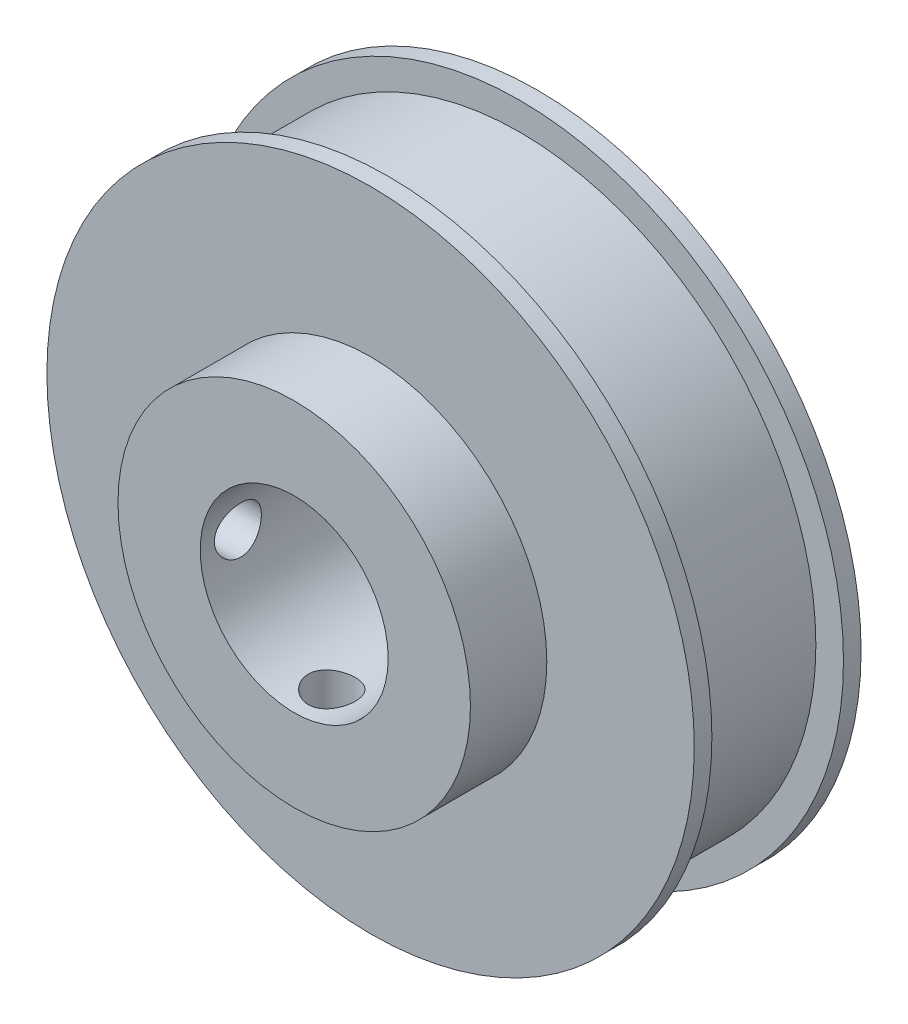
ISO-10303-21;
HEADER;
FILE_DESCRIPTION(('STEP AP214'),'2;1');
FILE_NAME('part.step','',(''),(''),'','','');
FILE_SCHEMA(('AUTOMOTIVE_DESIGN { 1 0 10303 214 1 1 1 1 }'));
ENDSEC;
DATA;
#1=APPLICATION_CONTEXT('core data for automotive mechanical design processes');
#2=APPLICATION_PROTOCOL_DEFINITION('international standard','automotive_design',2000,#1);
#3=PRODUCT_CONTEXT('',#1,'mechanical');
#4=PRODUCT('Part','Part','',(#3));
#5=PRODUCT_RELATED_PRODUCT_CATEGORY('part','',(#4));
#6=PRODUCT_DEFINITION_FORMATION('','',#4);
#7=PRODUCT_DEFINITION_CONTEXT('part definition',#1,'design');
#8=PRODUCT_DEFINITION('design','',#6,#7);
#9=PRODUCT_DEFINITION_SHAPE('','',#8);
#10=(LENGTH_UNIT() NAMED_UNIT(*) SI_UNIT(.MILLI.,.METRE.));
#11=(NAMED_UNIT(*) PLANE_ANGLE_UNIT() SI_UNIT($,.RADIAN.));
#12=(NAMED_UNIT(*) SI_UNIT($,.STERADIAN.) SOLID_ANGLE_UNIT());
#13=UNCERTAINTY_MEASURE_WITH_UNIT(LENGTH_MEASURE(1.E-05),#10,'distance_accuracy_value','');
#14=(GEOMETRIC_REPRESENTATION_CONTEXT(3) GLOBAL_UNCERTAINTY_ASSIGNED_CONTEXT((#13)) GLOBAL_UNIT_ASSIGNED_CONTEXT((#10,
#11,#12)) REPRESENTATION_CONTEXT('',''));
#15=CARTESIAN_POINT('',(0.,0.,0.));
#16=DIRECTION('',(0.,0.,1.));
#17=DIRECTION('',(1.,0.,0.));
#18=AXIS2_PLACEMENT_3D('',#15,#16,#17);
#19=CARTESIAN_POINT('',(0.,0.,14.2));
#20=DIRECTION('',(0.,0.,1.));
#21=DIRECTION('',(1.,0.,0.));
#22=AXIS2_PLACEMENT_3D('',#19,#20,#21);
#23=PLANE('',#22);
#24=CARTESIAN_POINT('',(0.,0.,14.2));
#25=DIRECTION('',(0.,0.,1.));
#26=DIRECTION('',(1.,0.,0.));
#27=AXIS2_PLACEMENT_3D('',#24,#25,#26);
#28=CIRCLE('',#27,27.55);
#29=CARTESIAN_POINT('',(27.55,0.,14.2));
#30=VERTEX_POINT('',#29);
#31=EDGE_CURVE('E144',#30,#30,#28,.T.);
#32=ORIENTED_EDGE('',*,*,#31,.T.);
#33=EDGE_LOOP('',(#32));
#34=FACE_BOUND('',#33,.T.);
#35=CARTESIAN_POINT('',(0.,0.,14.2));
#36=DIRECTION('',(0.,0.,1.));
#37=DIRECTION('',(1.,0.,0.));
#38=AXIS2_PLACEMENT_3D('',#35,#36,#37);
#39=CIRCLE('',#38,15.);
#40=CARTESIAN_POINT('',(15.,0.,14.2));
#41=VERTEX_POINT('',#40);
#42=EDGE_CURVE('E59',#41,#41,#39,.T.);
#43=ORIENTED_EDGE('',*,*,#42,.F.);
#44=EDGE_LOOP('',(#43));
#45=FACE_BOUND('',#44,.T.);
#46=ADVANCED_FACE('F31',(#34,#45),#23,.T.);
#47=CARTESIAN_POINT('',(0.,0.,1.5));
#48=DIRECTION('',(0.,0.,1.));
#49=DIRECTION('',(1.,0.,0.));
#50=AXIS2_PLACEMENT_3D('',#47,#48,#49);
#51=PLANE('',#50);
#52=CARTESIAN_POINT('',(0.,0.,1.5));
#53=DIRECTION('',(0.,0.,1.));
#54=DIRECTION('',(1.,0.,0.));
#55=AXIS2_PLACEMENT_3D('',#52,#53,#54);
#56=CIRCLE('',#55,27.55);
#57=CARTESIAN_POINT('',(27.55,0.,1.5));
#58=VERTEX_POINT('',#57);
#59=EDGE_CURVE('E10',#58,#58,#56,.T.);
#60=ORIENTED_EDGE('',*,*,#59,.T.);
#61=EDGE_LOOP('',(#60));
#62=FACE_BOUND('',#61,.T.);
#63=CARTESIAN_POINT('',(0.,0.,1.5));
#64=DIRECTION('',(0.,0.,1.));
#65=DIRECTION('',(1.,0.,0.));
#66=AXIS2_PLACEMENT_3D('',#63,#64,#65);
#67=CIRCLE('',#66,25.2);
#68=CARTESIAN_POINT('',(25.2,0.,1.5));
#69=VERTEX_POINT('',#68);
#70=EDGE_CURVE('E51',#69,#69,#67,.T.);
#71=ORIENTED_EDGE('',*,*,#70,.F.);
#72=EDGE_LOOP('',(#71));
#73=FACE_BOUND('',#72,.T.);
#74=ADVANCED_FACE('F97',(#62,#73),#51,.T.);
#75=CARTESIAN_POINT('',(0.,0.,1.5));
#76=DIRECTION('',(0.,0.,-1.));
#77=DIRECTION('',(-1.,0.,0.));
#78=AXIS2_PLACEMENT_3D('',#75,#76,#77);
#79=CYLINDRICAL_SURFACE('',#78,27.55);
#80=ORIENTED_EDGE('',*,*,#59,.F.);
#81=EDGE_LOOP('',(#80));
#82=FACE_BOUND('',#81,.T.);
#83=CARTESIAN_POINT('',(0.,0.,0.));
#84=DIRECTION('',(0.,0.,1.));
#85=DIRECTION('',(1.,0.,0.));
#86=AXIS2_PLACEMENT_3D('',#83,#84,#85);
#87=CIRCLE('',#86,27.55);
#88=CARTESIAN_POINT('',(27.55,0.,0.));
#89=VERTEX_POINT('',#88);
#90=EDGE_CURVE('E43',#89,#89,#87,.T.);
#91=ORIENTED_EDGE('',*,*,#90,.T.);
#92=EDGE_LOOP('',(#91));
#93=FACE_BOUND('',#92,.T.);
#94=ADVANCED_FACE('F33',(#82,#93),#79,.T.);
#95=CARTESIAN_POINT('',(0.,0.,0.));
#96=DIRECTION('',(0.,0.,1.));
#97=DIRECTION('',(1.,0.,0.));
#98=AXIS2_PLACEMENT_3D('',#95,#96,#97);
#99=PLANE('',#98);
#100=CARTESIAN_POINT('',(0.,0.,0.));
#101=DIRECTION('',(0.,0.,1.));
#102=DIRECTION('',(1.,0.,0.));
#103=AXIS2_PLACEMENT_3D('',#100,#101,#102);
#104=CIRCLE('',#103,8.);
#105=CARTESIAN_POINT('',(8.,0.,0.));
#106=VERTEX_POINT('',#105);
#107=EDGE_CURVE('E127',#106,#106,#104,.T.);
#108=ORIENTED_EDGE('',*,*,#107,.T.);
#109=EDGE_LOOP('',(#108));
#110=FACE_BOUND('',#109,.T.);
#111=ORIENTED_EDGE('',*,*,#90,.F.);
#112=EDGE_LOOP('',(#111));
#113=FACE_BOUND('',#112,.T.);
#114=ADVANCED_FACE('F116',(#110,#113),#99,.F.);
#115=CARTESIAN_POINT('',(0.,0.,12.7));
#116=DIRECTION('',(0.,0.,-1.));
#117=DIRECTION('',(-1.,0.,0.));
#118=AXIS2_PLACEMENT_3D('',#115,#116,#117);
#119=CYLINDRICAL_SURFACE('',#118,25.2);
#120=CARTESIAN_POINT('',(0.,0.,12.7));
#121=DIRECTION('',(0.,0.,1.));
#122=DIRECTION('',(1.,0.,0.));
#123=AXIS2_PLACEMENT_3D('',#120,#121,#122);
#124=CIRCLE('',#123,25.2);
#125=CARTESIAN_POINT('',(25.2,0.,12.7));
#126=VERTEX_POINT('',#125);
#127=EDGE_CURVE('E48',#126,#126,#124,.T.);
#128=ORIENTED_EDGE('',*,*,#127,.F.);
#129=EDGE_LOOP('',(#128));
#130=FACE_BOUND('',#129,.T.);
#131=ORIENTED_EDGE('',*,*,#70,.T.);
#132=EDGE_LOOP('',(#131));
#133=FACE_BOUND('',#132,.T.);
#134=ADVANCED_FACE('F110',(#130,#133),#119,.T.);
#135=CARTESIAN_POINT('',(0.,0.,12.7));
#136=DIRECTION('',(0.,0.,1.));
#137=DIRECTION('',(1.,0.,0.));
#138=AXIS2_PLACEMENT_3D('',#135,#136,#137);
#139=PLANE('',#138);
#140=CARTESIAN_POINT('',(0.,0.,12.7));
#141=DIRECTION('',(0.,0.,1.));
#142=DIRECTION('',(1.,0.,0.));
#143=AXIS2_PLACEMENT_3D('',#140,#141,#142);
#144=CIRCLE('',#143,27.55);
#145=CARTESIAN_POINT('',(27.55,0.,12.7));
#146=VERTEX_POINT('',#145);
#147=EDGE_CURVE('E142',#146,#146,#144,.T.);
#148=ORIENTED_EDGE('',*,*,#147,.F.);
#149=EDGE_LOOP('',(#148));
#150=FACE_BOUND('',#149,.T.);
#151=ORIENTED_EDGE('',*,*,#127,.T.);
#152=EDGE_LOOP('',(#151));
#153=FACE_BOUND('',#152,.T.);
#154=ADVANCED_FACE('F106',(#150,#153),#139,.F.);
#155=CARTESIAN_POINT('',(0.,0.,14.2));
#156=DIRECTION('',(0.,0.,-1.));
#157=DIRECTION('',(-1.,0.,0.));
#158=AXIS2_PLACEMENT_3D('',#155,#156,#157);
#159=CYLINDRICAL_SURFACE('',#158,27.55);
#160=ORIENTED_EDGE('',*,*,#31,.F.);
#161=EDGE_LOOP('',(#160));
#162=FACE_BOUND('',#161,.T.);
#163=ORIENTED_EDGE('',*,*,#147,.T.);
#164=EDGE_LOOP('',(#163));
#165=FACE_BOUND('',#164,.T.);
#166=ADVANCED_FACE('F109',(#162,#165),#159,.T.);
#167=CARTESIAN_POINT('',(0.,0.,20.7));
#168=DIRECTION('',(0.,0.,-1.));
#169=DIRECTION('',(-1.,0.,0.));
#170=AXIS2_PLACEMENT_3D('',#167,#168,#169);
#171=CYLINDRICAL_SURFACE('',#170,15.);
#172=CARTESIAN_POINT('',(-15.,0.,19.5));
#173=CARTESIAN_POINT('',(-14.9999983574254,-0.111808835669284,19.4999952902931));
#174=CARTESIAN_POINT('',(-14.9987367072719,-0.22368597927628,19.4905924620375));
#175=CARTESIAN_POINT('',(-14.993825111269,-0.444322725138079,19.4532336509504));
#176=CARTESIAN_POINT('',(-14.9901727244172,-0.553079022333037,19.4252587051029));
#177=CARTESIAN_POINT('',(-14.9808907984907,-0.764248312626984,19.3515982824586));
#178=CARTESIAN_POINT('',(-14.9752626421097,-0.866665683058493,19.3059251889616));
#179=CARTESIAN_POINT('',(-14.9626538666039,-1.0623638950303,19.1981930861937));
#180=CARTESIAN_POINT('',(-14.9556734655857,-1.15564620633703,19.1361367188335));
#181=CARTESIAN_POINT('',(-14.9410899478996,-1.33102582250468,18.9969867383958));
#182=CARTESIAN_POINT('',(-14.9334835816211,-1.41305798549586,18.9198113549915));
#183=CARTESIAN_POINT('',(-14.9185313755795,-1.56304735673102,18.7527898109233));
#184=CARTESIAN_POINT('',(-14.9111855496234,-1.63100381997221,18.6629429800042));
#185=CARTESIAN_POINT('',(-14.8975543544019,-1.75115902268907,18.472700877055));
#186=CARTESIAN_POINT('',(-14.8912731776576,-1.80329607482578,18.3722663175214));
#187=CARTESIAN_POINT('',(-14.8805258737923,-1.8899384500729,18.1639689327632));
#188=CARTESIAN_POINT('',(-14.8760596685121,-1.92444453245278,18.0561064276467));
#189=CARTESIAN_POINT('',(-14.8694793656867,-1.97464606772174,17.8366941894984));
#190=CARTESIAN_POINT('',(-14.8673514537014,-1.99045204228507,17.7251701654671));
#191=CARTESIAN_POINT('',(-14.8656465160931,-2.00314680548117,17.501033820394));
#192=CARTESIAN_POINT('',(-14.866069374204,-2.00003645633601,17.3884215491891));
#193=CARTESIAN_POINT('',(-14.8694055577299,-1.97507745939235,17.1660788699721));
#194=CARTESIAN_POINT('',(-14.8723026462234,-1.95335097531762,17.0563344701143));
#195=CARTESIAN_POINT('',(-14.8802355277475,-1.89196724634372,16.8420631632399));
#196=CARTESIAN_POINT('',(-14.8852713695413,-1.85230959261458,16.737536375245));
#197=CARTESIAN_POINT('',(-14.8969326111103,-1.75605929143191,16.5362903652928));
#198=CARTESIAN_POINT('',(-14.903562941239,-1.69941397913749,16.4395966288057));
#199=CARTESIAN_POINT('',(-14.9176623621993,-1.57083393344289,16.2570409180823));
#200=CARTESIAN_POINT('',(-14.9251314966353,-1.49889840502385,16.1711795074458));
#201=CARTESIAN_POINT('',(-14.9401389923359,-1.34110490026363,16.0120169874181));
#202=CARTESIAN_POINT('',(-14.947677435412,-1.25514170702645,15.9388201572977));
#203=CARTESIAN_POINT('',(-14.9619192381826,-1.07209417013341,15.8078779550716));
#204=CARTESIAN_POINT('',(-14.9686225954715,-0.975009794442371,15.7501326274765));
#205=CARTESIAN_POINT('',(-14.9804439374358,-0.772392219730472,15.6517308823053));
#206=CARTESIAN_POINT('',(-14.9855612720896,-0.666855578841232,15.6110814689537));
#207=CARTESIAN_POINT('',(-14.9936282590407,-0.450370924336252,15.5481106810277));
#208=CARTESIAN_POINT('',(-14.9965780268993,-0.33942319954226,15.5257883293606));
#209=CARTESIAN_POINT('',(-14.9999624137686,-0.116166903325648,15.5002415672289));
#210=CARTESIAN_POINT('',(-15.0004159384905,-0.00387503454704613,15.4968735982165));
#211=CARTESIAN_POINT('',(-14.9988079153852,0.219671617218714,15.5089516641272));
#212=CARTESIAN_POINT('',(-14.996746428686,0.330926425345661,15.5243972417824));
#213=CARTESIAN_POINT('',(-14.990351753581,0.548813715572934,15.573544653384));
#214=CARTESIAN_POINT('',(-14.9860271430292,0.655462016512041,15.6071775683222));
#215=CARTESIAN_POINT('',(-14.9755900925429,0.861605098793556,15.6916729659371));
#216=CARTESIAN_POINT('',(-14.9694775843944,0.961099607015634,15.7425361060133));
#217=CARTESIAN_POINT('',(-14.9560983737007,1.15074887861607,15.8603921555833));
#218=CARTESIAN_POINT('',(-14.9488251504572,1.2408458143966,15.9274773657133));
#219=CARTESIAN_POINT('',(-14.9339572870998,1.40855294699189,16.0757433292243));
#220=CARTESIAN_POINT('',(-14.9263626324062,1.48616257662378,16.1569247225164));
#221=CARTESIAN_POINT('',(-14.9116490247351,1.62720549423098,16.3317131426396));
#222=CARTESIAN_POINT('',(-14.904533487753,1.69054327608938,16.4253975667382));
#223=CARTESIAN_POINT('',(-14.8916413300182,1.80058351078813,16.6221594102809));
#224=CARTESIAN_POINT('',(-14.8858646793678,1.84728633510346,16.7252366199104));
#225=CARTESIAN_POINT('',(-14.8763281178008,1.92257836500746,16.9375572420277));
#226=CARTESIAN_POINT('',(-14.872562342326,1.95122028846795,17.0467816852108));
#227=CARTESIAN_POINT('',(-14.8674574869829,1.98974667143958,17.2685436321288));
#228=CARTESIAN_POINT('',(-14.8661182773134,1.99963213426781,17.3810809583244));
#229=CARTESIAN_POINT('',(-14.8660223129545,2.00034485806189,17.6053234908535));
#230=CARTESIAN_POINT('',(-14.8672452228252,1.99132219194492,17.7170282409642));
#231=CARTESIAN_POINT('',(-14.872091838742,1.95479376686689,17.9373178751039));
#232=CARTESIAN_POINT('',(-14.8757155438883,1.92728801483268,18.045902760302));
#233=CARTESIAN_POINT('',(-14.8849489027276,1.85462310332207,18.2568436832516));
#234=CARTESIAN_POINT('',(-14.890557626594,1.80947220819041,18.3592026111169));
#235=CARTESIAN_POINT('',(-14.9031304571282,1.70281342759737,18.5549158838261));
#236=CARTESIAN_POINT('',(-14.910094589966,1.64130522630428,18.648270054756));
#237=CARTESIAN_POINT('',(-14.9246596718306,1.50312448509508,18.8240896499284));
#238=CARTESIAN_POINT('',(-14.9322650575408,1.42634027226901,18.9064669477551));
#239=CARTESIAN_POINT('',(-14.9472171900166,1.26002169349824,19.0572232163615));
#240=CARTESIAN_POINT('',(-14.9545638756898,1.17048434072977,19.1255988987502));
#241=CARTESIAN_POINT('',(-14.9682063513753,0.980752987852819,19.2466671384665));
#242=CARTESIAN_POINT('',(-14.9744974642689,0.880514620743964,19.2992906665552));
#243=CARTESIAN_POINT('',(-14.9852732065897,0.672592409587328,19.3868805985451));
#244=CARTESIAN_POINT('',(-14.9897597692431,0.564916678969889,19.4218659086249));
#245=CARTESIAN_POINT('',(-14.9953572174327,0.380588408098419,19.4649480063852));
#246=CARTESIAN_POINT('',(-14.9970896363507,0.305091081955779,19.4780732435236));
#247=CARTESIAN_POINT('',(-14.9994115849077,0.153073171616112,19.4956008141655));
#248=CARTESIAN_POINT('',(-15.000001124628,0.0765525964512405,19.5000032246136));
#249=CARTESIAN_POINT('',(-15.,0.,19.5));
#250=B_SPLINE_CURVE_WITH_KNOTS('',3,(#172,#173,#174,#175,#176,#177,#178,#179,#180,#181,#182,
#183,#184,#185,#186,#187,#188,#189,#190,#191,#192,#193,#194,#195,#196,#197,#198,#199,#200,#201,
#202,#203,#204,#205,#206,#207,#208,#209,#210,#211,#212,#213,#214,#215,#216,#217,#218,#219,#220,
#221,#222,#223,#224,#225,#226,#227,#228,#229,#230,#231,#232,#233,#234,#235,#236,#237,#238,#239,
#240,#241,#242,#243,#244,#245,#246,#247,#248,#249),.UNSPECIFIED.,.T.,.F.,(4,2,2,2,2,2,2,2,2,2,2,
2,2,2,2,2,2,2,2,2,2,2,2,2,2,2,2,2,2,2,2,2,2,2,2,2,2,2,4),(0.,0.335146851305743,
0.670636430885044,1.0058916928274,1.34109292564034,1.67815978443559,2.01524447904836,
2.35362721511647,2.69199537766204,3.02835355914359,3.3646964092492,3.69884885098043,
4.0330089117585,4.36821583137897,4.70344018443797,5.0413054448485,5.37917167852296,
5.71717620202539,6.05516270391743,6.39058584992061,6.72600084354478,7.06015363396463,
7.39431917503546,7.73043274769884,8.06656158258761,8.4048770453545,8.74318495273048,
9.08050074735454,9.41779849783634,9.75242927496624,10.0870599266875,10.4215340370262,
10.756014605959,11.0930366783511,11.4301378125116,11.7686952667451,12.1068890499242,
12.3363573904731,12.5658237068544),.UNSPECIFIED.);
#251=CARTESIAN_POINT('',(-15.,0.,19.5));
#252=VERTEX_POINT('',#251);
#253=EDGE_CURVE('E60',#252,#252,#250,.T.);
#254=ORIENTED_EDGE('',*,*,#253,.T.);
#255=EDGE_LOOP('',(#254));
#256=FACE_BOUND('',#255,.T.);
#257=CARTESIAN_POINT('',(0.,-15.,19.5));
#258=CARTESIAN_POINT('',(0.111808835669287,-14.9999983574254,19.4999952902931));
#259=CARTESIAN_POINT('',(0.223685979276282,-14.9987367072719,19.4905924620375));
#260=CARTESIAN_POINT('',(0.444322725138081,-14.993825111269,19.4532336509504));
#261=CARTESIAN_POINT('',(0.553079022333039,-14.9901727244172,19.4252587051029));
#262=CARTESIAN_POINT('',(0.764248312626988,-14.9808907984907,19.3515982824585));
#263=CARTESIAN_POINT('',(0.866665683058498,-14.9752626421097,19.3059251889616));
#264=CARTESIAN_POINT('',(1.0623638950303,-14.9626538666039,19.1981930861937));
#265=CARTESIAN_POINT('',(1.15564620633703,-14.9556734655857,19.1361367188335));
#266=CARTESIAN_POINT('',(1.33102582250468,-14.9410899478996,18.9969867383958));
#267=CARTESIAN_POINT('',(1.41305798549587,-14.9334835816211,18.9198113549915));
#268=CARTESIAN_POINT('',(1.56304735673102,-14.9185313755795,18.7527898109233));
#269=CARTESIAN_POINT('',(1.63100381997222,-14.9111855496234,18.6629429800042));
#270=CARTESIAN_POINT('',(1.75115902268908,-14.8975543544019,18.472700877055));
#271=CARTESIAN_POINT('',(1.80329607482578,-14.8912731776576,18.3722663175214));
#272=CARTESIAN_POINT('',(1.88993845007291,-14.8805258737923,18.1639689327632));
#273=CARTESIAN_POINT('',(1.92444453245278,-14.8760596685121,18.0561064276467));
#274=CARTESIAN_POINT('',(1.97464606772174,-14.8694793656867,17.8366941894983));
#275=CARTESIAN_POINT('',(1.99045204228507,-14.8673514537014,17.7251701654671));
#276=CARTESIAN_POINT('',(2.00314680548118,-14.8656465160931,17.501033820394));
#277=CARTESIAN_POINT('',(2.00003645633601,-14.866069374204,17.3884215491891));
#278=CARTESIAN_POINT('',(1.97507745939235,-14.8694055577299,17.1660788699721));
#279=CARTESIAN_POINT('',(1.95335097531762,-14.8723026462234,17.0563344701143));
#280=CARTESIAN_POINT('',(1.89196724634372,-14.8802355277475,16.8420631632399));
#281=CARTESIAN_POINT('',(1.85230959261458,-14.8852713695413,16.737536375245));
#282=CARTESIAN_POINT('',(1.75605929143191,-14.8969326111103,16.5362903652928));
#283=CARTESIAN_POINT('',(1.69941397913749,-14.903562941239,16.4395966288057));
#284=CARTESIAN_POINT('',(1.57083393344289,-14.9176623621993,16.2570409180823));
#285=CARTESIAN_POINT('',(1.49889840502385,-14.9251314966353,16.1711795074458));
#286=CARTESIAN_POINT('',(1.34110490026363,-14.9401389923359,16.0120169874181));
#287=CARTESIAN_POINT('',(1.25514170702645,-14.947677435412,15.9388201572977));
#288=CARTESIAN_POINT('',(1.07209417013341,-14.9619192381826,15.8078779550716));
#289=CARTESIAN_POINT('',(0.97500979444237,-14.9686225954715,15.7501326274765));
#290=CARTESIAN_POINT('',(0.772392219730471,-14.9804439374358,15.6517308823053));
#291=CARTESIAN_POINT('',(0.666855578841231,-14.9855612720896,15.6110814689537));
#292=CARTESIAN_POINT('',(0.45037092433625,-14.9936282590407,15.5481106810277));
#293=CARTESIAN_POINT('',(0.339423199542258,-14.9965780268993,15.5257883293606));
#294=CARTESIAN_POINT('',(0.116166903325644,-14.9999624137686,15.5002415672289));
#295=CARTESIAN_POINT('',(0.00387503454704304,-15.0004159384905,15.4968735982165));
#296=CARTESIAN_POINT('',(-0.219671617218717,-14.9988079153852,15.5089516641272));
#297=CARTESIAN_POINT('',(-0.330926425345664,-14.996746428686,15.5243972417824));
#298=CARTESIAN_POINT('',(-0.548813715572937,-14.990351753581,15.573544653384));
#299=CARTESIAN_POINT('',(-0.655462016512044,-14.9860271430292,15.6071775683222));
#300=CARTESIAN_POINT('',(-0.861605098793559,-14.9755900925429,15.6916729659371));
#301=CARTESIAN_POINT('',(-0.961099607015637,-14.9694775843944,15.7425361060133));
#302=CARTESIAN_POINT('',(-1.15074887861608,-14.9560983737007,15.8603921555833));
#303=CARTESIAN_POINT('',(-1.2408458143966,-14.9488251504572,15.9274773657133));
#304=CARTESIAN_POINT('',(-1.40855294699189,-14.9339572870998,16.0757433292243));
#305=CARTESIAN_POINT('',(-1.48616257662378,-14.9263626324062,16.1569247225164));
#306=CARTESIAN_POINT('',(-1.62720549423098,-14.9116490247351,16.3317131426396));
#307=CARTESIAN_POINT('',(-1.69054327608938,-14.904533487753,16.4253975667382));
#308=CARTESIAN_POINT('',(-1.80058351078814,-14.8916413300182,16.6221594102809));
#309=CARTESIAN_POINT('',(-1.84728633510346,-14.8858646793678,16.7252366199104));
#310=CARTESIAN_POINT('',(-1.92257836500746,-14.8763281178008,16.9375572420277));
#311=CARTESIAN_POINT('',(-1.95122028846795,-14.872562342326,17.0467816852108));
#312=CARTESIAN_POINT('',(-1.98974667143959,-14.8674574869829,17.2685436321288));
#313=CARTESIAN_POINT('',(-1.99963213426782,-14.8661182773134,17.3810809583244));
#314=CARTESIAN_POINT('',(-2.00034485806189,-14.8660223129545,17.6053234908535));
#315=CARTESIAN_POINT('',(-1.99132219194492,-14.8672452228252,17.7170282409642));
#316=CARTESIAN_POINT('',(-1.95479376686689,-14.872091838742,17.9373178751039));
#317=CARTESIAN_POINT('',(-1.92728801483268,-14.8757155438883,18.045902760302));
#318=CARTESIAN_POINT('',(-1.85462310332207,-14.8849489027276,18.2568436832516));
#319=CARTESIAN_POINT('',(-1.80947220819041,-14.890557626594,18.3592026111169));
#320=CARTESIAN_POINT('',(-1.70281342759737,-14.9031304571282,18.5549158838261));
#321=CARTESIAN_POINT('',(-1.64130522630428,-14.910094589966,18.648270054756));
#322=CARTESIAN_POINT('',(-1.50312448509508,-14.9246596718306,18.8240896499284));
#323=CARTESIAN_POINT('',(-1.42634027226901,-14.9322650575408,18.9064669477551));
#324=CARTESIAN_POINT('',(-1.26002169349823,-14.9472171900166,19.0572232163615));
#325=CARTESIAN_POINT('',(-1.17048434072977,-14.9545638756898,19.1255988987503));
#326=CARTESIAN_POINT('',(-0.980752987852821,-14.9682063513753,19.2466671384665));
#327=CARTESIAN_POINT('',(-0.880514620743962,-14.9744974642689,19.2992906665552));
#328=CARTESIAN_POINT('',(-0.672592409587325,-14.9852732065897,19.3868805985451));
#329=CARTESIAN_POINT('',(-0.564916678969886,-14.9897597692431,19.4218659086249));
#330=CARTESIAN_POINT('',(-0.380588408098415,-14.9953572174327,19.4649480063852));
#331=CARTESIAN_POINT('',(-0.305091081955775,-14.9970896363507,19.4780732435236));
#332=CARTESIAN_POINT('',(-0.153073171616109,-14.9994115849077,19.4956008141655));
#333=CARTESIAN_POINT('',(-0.0765525964512377,-15.000001124628,19.5000032246136));
#334=CARTESIAN_POINT('',(0.,-15.,19.5));
#335=B_SPLINE_CURVE_WITH_KNOTS('',3,(#257,#258,#259,#260,#261,#262,#263,#264,#265,#266,#267,
#268,#269,#270,#271,#272,#273,#274,#275,#276,#277,#278,#279,#280,#281,#282,#283,#284,#285,#286,
#287,#288,#289,#290,#291,#292,#293,#294,#295,#296,#297,#298,#299,#300,#301,#302,#303,#304,#305,
#306,#307,#308,#309,#310,#311,#312,#313,#314,#315,#316,#317,#318,#319,#320,#321,#322,#323,#324,
#325,#326,#327,#328,#329,#330,#331,#332,#333,#334),.UNSPECIFIED.,.T.,.F.,(4,2,2,2,2,2,2,2,2,2,2,
2,2,2,2,2,2,2,2,2,2,2,2,2,2,2,2,2,2,2,2,2,2,2,2,2,2,2,4),(0.,0.335146851305743,
0.670636430885046,1.00589169282741,1.34109292564035,1.67815978443559,2.01524447904836,
2.35362721511648,2.69199537766205,3.02835355914359,3.3646964092492,3.69884885098043,
4.0330089117585,4.36821583137898,4.70344018443797,5.0413054448485,5.37917167852296,
5.71717620202539,6.05516270391743,6.39058584992061,6.72600084354479,7.06015363396464,
7.39431917503546,7.73043274769884,8.06656158258762,8.4048770453545,8.74318495273048,
9.08050074735455,9.41779849783635,9.75242927496625,10.0870599266875,10.4215340370262,
10.756014605959,11.0930366783511,11.4301378125116,11.7686952667452,12.1068890499242,
12.3363573904731,12.5658237068544),.UNSPECIFIED.);
#336=CARTESIAN_POINT('',(0.,-15.,19.5));
#337=VERTEX_POINT('',#336);
#338=EDGE_CURVE('E53',#337,#337,#335,.T.);
#339=ORIENTED_EDGE('',*,*,#338,.T.);
#340=EDGE_LOOP('',(#339));
#341=FACE_BOUND('',#340,.T.);
#342=CARTESIAN_POINT('',(0.,0.,20.7));
#343=DIRECTION('',(0.,0.,1.));
#344=DIRECTION('',(1.,0.,0.));
#345=AXIS2_PLACEMENT_3D('',#342,#343,#344);
#346=CIRCLE('',#345,15.);
#347=CARTESIAN_POINT('',(15.,0.,20.7));
#348=VERTEX_POINT('',#347);
#349=EDGE_CURVE('E140',#348,#348,#346,.T.);
#350=ORIENTED_EDGE('',*,*,#349,.F.);
#351=EDGE_LOOP('',(#350));
#352=FACE_BOUND('',#351,.T.);
#353=ORIENTED_EDGE('',*,*,#42,.T.);
#354=EDGE_LOOP('',(#353));
#355=FACE_BOUND('',#354,.T.);
#356=ADVANCED_FACE('F61',(#256,#341,#352,#355),#171,.T.);
#357=CARTESIAN_POINT('',(0.,0.,20.7));
#358=DIRECTION('',(0.,0.,1.));
#359=DIRECTION('',(1.,0.,0.));
#360=AXIS2_PLACEMENT_3D('',#357,#358,#359);
#361=PLANE('',#360);
#362=CARTESIAN_POINT('',(0.,0.,20.7));
#363=DIRECTION('',(0.,0.,1.));
#364=DIRECTION('',(1.,0.,0.));
#365=AXIS2_PLACEMENT_3D('',#362,#363,#364);
#366=CIRCLE('',#365,8.);
#367=CARTESIAN_POINT('',(8.,0.,20.7));
#368=VERTEX_POINT('',#367);
#369=EDGE_CURVE('E80',#368,#368,#366,.T.);
#370=ORIENTED_EDGE('',*,*,#369,.F.);
#371=EDGE_LOOP('',(#370));
#372=FACE_BOUND('',#371,.T.);
#373=ORIENTED_EDGE('',*,*,#349,.T.);
#374=EDGE_LOOP('',(#373));
#375=FACE_BOUND('',#374,.T.);
#376=ADVANCED_FACE('F69',(#372,#375),#361,.T.);
#377=CARTESIAN_POINT('',(0.,-27.55,17.5));
#378=DIRECTION('',(0.,1.,0.));
#379=DIRECTION('',(0.,0.,1.));
#380=AXIS2_PLACEMENT_3D('',#377,#378,#379);
#381=CYLINDRICAL_SURFACE('',#380,2.);
#382=CARTESIAN_POINT('',(0.,-8.,19.5));
#383=CARTESIAN_POINT('',(0.110501451559644,-7.99999813157349,19.4999968990158));
#384=CARTESIAN_POINT('',(0.221037543774353,-7.99768770842435,19.490811265635));
#385=CARTESIAN_POINT('',(0.438941765027379,-7.98869485106526,19.454366464924));
#386=CARTESIAN_POINT('',(0.546308062494322,-7.98200993893301,19.4270970539495));
#387=CARTESIAN_POINT('',(0.754694496243438,-7.96500835109376,19.3554143287172));
#388=CARTESIAN_POINT('',(0.855722084573338,-7.95469603789411,19.311021601713));
#389=CARTESIAN_POINT('',(1.04889617587257,-7.93153791743495,19.2064248132735));
#390=CARTESIAN_POINT('',(1.14104237913169,-7.91869202472208,19.146220218508));
#391=CARTESIAN_POINT('',(1.31573590306789,-7.89156551455591,19.0103989471278));
#392=CARTESIAN_POINT('',(1.39807425341474,-7.87726276197502,18.9345179000546));
#393=CARTESIAN_POINT('',(1.54899856960443,-7.84898160157248,18.770063726788));
#394=CARTESIAN_POINT('',(1.61758298259893,-7.83500323053157,18.6814891694041));
#395=CARTESIAN_POINT('',(1.74003539039864,-7.80873034264225,18.492539697684));
#396=CARTESIAN_POINT('',(1.79366962123352,-7.79646392619748,18.3920090255884));
#397=CARTESIAN_POINT('',(1.88319587806766,-7.77532659757355,18.1830021177866));
#398=CARTESIAN_POINT('',(1.91909074058686,-7.76645514259225,18.0745271555573));
#399=CARTESIAN_POINT('',(1.97140644907302,-7.7533396892843,17.8550086690645));
#400=CARTESIAN_POINT('',(1.98820302444274,-7.74900654662681,17.744060138616));
#401=CARTESIAN_POINT('',(2.00301570008855,-7.74519149946122,17.5208419080009));
#402=CARTESIAN_POINT('',(2.00103485575748,-7.74570880570571,17.4085724257438));
#403=CARTESIAN_POINT('',(1.97864869951961,-7.75145607355756,17.1887789230062));
#404=CARTESIAN_POINT('',(1.95869112025418,-7.75657150676391,17.0812058380462));
#405=CARTESIAN_POINT('',(1.90163224920399,-7.77075612894758,16.8709852654519));
#406=CARTESIAN_POINT('',(1.86452973609253,-7.77982559958985,16.7683381292948));
#407=CARTESIAN_POINT('',(1.77385263724958,-7.80100151874212,16.5696826449972));
#408=CARTESIAN_POINT('',(1.72011555631056,-7.81313769959755,16.4737517709472));
#409=CARTESIAN_POINT('',(1.59780836801993,-7.83906281127988,16.2921083869909));
#410=CARTESIAN_POINT('',(1.52923566507845,-7.85285203112837,16.2063976692437));
#411=CARTESIAN_POINT('',(1.37688456624163,-7.88101174053188,16.0450618457408));
#412=CARTESIAN_POINT('',(1.29272834422115,-7.89538759304001,15.9697940132515));
#413=CARTESIAN_POINT('',(1.11281589000493,-7.92274620771675,15.8343716767148));
#414=CARTESIAN_POINT('',(1.01705930361059,-7.93572892732543,15.7742176343152));
#415=CARTESIAN_POINT('',(0.816154518241856,-7.9589030945892,15.6705992183675));
#416=CARTESIAN_POINT('',(0.710975190944832,-7.96908480170303,15.6271928796608));
#417=CARTESIAN_POINT('',(0.494501344190511,-7.98543889321888,15.5587769257206));
#418=CARTESIAN_POINT('',(0.383207998867313,-7.99161204452374,15.5337637914425));
#419=CARTESIAN_POINT('',(0.160719960520036,-7.999139990285,15.5033899125882));
#420=CARTESIAN_POINT('',(0.049595626650947,-8.00061404677705,15.4975426318996));
#421=CARTESIAN_POINT('',(-0.172043833068676,-7.99891739752601,15.5043320027407));
#422=CARTESIAN_POINT('',(-0.282559012859459,-7.99574710989128,15.5169669903988));
#423=CARTESIAN_POINT('',(-0.498152358368655,-7.98519441503143,15.5599612111885));
#424=CARTESIAN_POINT('',(-0.603286825291672,-7.97787512247748,15.5900550179693));
#425=CARTESIAN_POINT('',(-0.807009723270015,-7.95984942178845,15.6668094453713));
#426=CARTESIAN_POINT('',(-0.905597492043512,-7.94914267159856,15.7134717390842));
#427=CARTESIAN_POINT('',(-1.0953641792398,-7.92524410568414,15.8229815051663));
#428=CARTESIAN_POINT('',(-1.18638058911444,-7.91201156489243,15.8861014831957));
#429=CARTESIAN_POINT('',(-1.35670215152433,-7.88459345583226,16.0263865450626));
#430=CARTESIAN_POINT('',(-1.43600527863068,-7.87040772335606,16.1035540528225));
#431=CARTESIAN_POINT('',(-1.58265409076364,-7.84225275947695,16.2720026144593));
#432=CARTESIAN_POINT('',(-1.64965849016271,-7.82829738916375,16.3635836040032));
#433=CARTESIAN_POINT('',(-1.7673476786836,-7.80257171169652,16.5569768459543));
#434=CARTESIAN_POINT('',(-1.81803319221058,-7.79080130756035,16.6587886439463));
#435=CARTESIAN_POINT('',(-1.90126856081239,-7.77090792979554,16.8692076298841));
#436=CARTESIAN_POINT('',(-1.93392586220542,-7.76276340389207,16.9777701711253));
#437=CARTESIAN_POINT('',(-1.98046087993837,-7.75102325453578,17.1990795171855));
#438=CARTESIAN_POINT('',(-1.99434270330488,-7.74742663626582,17.3118254013767));
#439=CARTESIAN_POINT('',(-2.00271812044532,-7.74526534938609,17.5348280318069));
#440=CARTESIAN_POINT('',(-1.99775719704016,-7.74655910304352,17.645063246833));
#441=CARTESIAN_POINT('',(-1.96983637108382,-7.7537054534379,17.8630718515573));
#442=CARTESIAN_POINT('',(-1.94687683024902,-7.75955795855809,17.9708452906849));
#443=CARTESIAN_POINT('',(-1.88390842592372,-7.77508347576963,18.1802779454205));
#444=CARTESIAN_POINT('',(-1.84400187290716,-7.78473353648412,18.2819697403203));
#445=CARTESIAN_POINT('',(-1.74835321814009,-7.80677007633105,18.4772871769516));
#446=CARTESIAN_POINT('',(-1.69260892004558,-7.81915693494364,18.5709116975826));
#447=CARTESIAN_POINT('',(-1.56515699818285,-7.8456751235135,18.7500728386694));
#448=CARTESIAN_POINT('',(-1.493070883883,-7.8598435310901,18.8353347645653));
#449=CARTESIAN_POINT('',(-1.33571916158631,-7.88810702995048,18.9927293930606));
#450=CARTESIAN_POINT('',(-1.25045042834819,-7.90220210302746,19.064858973484));
#451=CARTESIAN_POINT('',(-1.06729011560345,-7.92903540863551,19.1952150780861));
#452=CARTESIAN_POINT('',(-0.969197896421845,-7.94174444487824,19.2531661515621));
#453=CARTESIAN_POINT('',(-0.764354746013963,-7.96406566633491,19.3516632839207));
#454=CARTESIAN_POINT('',(-0.657610084582315,-7.97368006933042,19.3922218141981));
#455=CARTESIAN_POINT('',(-0.459213670991291,-7.98730746087389,19.4487624404395));
#456=CARTESIAN_POINT('',(-0.368506894544087,-7.99203446736921,19.4679349907379));
#457=CARTESIAN_POINT('',(-0.185208095381708,-7.99838140309265,19.4935545914959));
#458=CARTESIAN_POINT('',(-0.0926162149901523,-8.00000156601192,19.5000025990737));
#459=CARTESIAN_POINT('',(0.,-8.,19.5));
#460=B_SPLINE_CURVE_WITH_KNOTS('',3,(#382,#383,#384,#385,#386,#387,#388,#389,#390,#391,#392,
#393,#394,#395,#396,#397,#398,#399,#400,#401,#402,#403,#404,#405,#406,#407,#408,#409,#410,#411,
#412,#413,#414,#415,#416,#417,#418,#419,#420,#421,#422,#423,#424,#425,#426,#427,#428,#429,#430,
#431,#432,#433,#434,#435,#436,#437,#438,#439,#440,#441,#442,#443,#444,#445,#446,#447,#448,#449,
#450,#451,#452,#453,#454,#455,#456,#457,#458,#459),.UNSPECIFIED.,.T.,.F.,(4,2,2,2,2,2,2,2,2,2,2,
2,2,2,2,2,2,2,2,2,2,2,2,2,2,2,2,2,2,2,2,2,2,2,2,2,2,2,4),(0.,0.331164949962519,
0.662517650351867,0.993473203048142,1.32443992022577,1.66152580582852,1.99864972773416,
2.34078196727743,2.68285948225825,3.01808393468094,3.3532538415469,3.68029996013785,
4.00736937959146,4.337740371696,4.66816921119312,5.00802001296454,5.34788119415424,
5.6889097201658,6.02987298255952,6.36211078603463,6.69431868154752,7.02160366023144,
7.34892169767482,7.68204783424897,8.01523150681787,8.35659345610396,8.69794025003772,
9.03723006156476,9.37644564340972,9.70591707202578,10.0353818794581,10.3628853408369,
10.6904342418696,11.0265276855098,11.3627009303165,11.7049624733721,12.0469781843289,
12.3245632392729,12.6021274139515),.UNSPECIFIED.);
#461=CARTESIAN_POINT('',(0.,-8.,19.5));
#462=VERTEX_POINT('',#461);
#463=EDGE_CURVE('E74',#462,#462,#460,.T.);
#464=ORIENTED_EDGE('',*,*,#463,.T.);
#465=EDGE_LOOP('',(#464));
#466=FACE_BOUND('',#465,.T.);
#467=ORIENTED_EDGE('',*,*,#338,.F.);
#468=EDGE_LOOP('',(#467));
#469=FACE_BOUND('',#468,.T.);
#470=ADVANCED_FACE('F65',(#466,#469),#381,.F.);
#471=CARTESIAN_POINT('',(-27.55,0.,17.5));
#472=DIRECTION('',(1.,0.,0.));
#473=DIRECTION('',(0.,0.,-1.));
#474=AXIS2_PLACEMENT_3D('',#471,#472,#473);
#475=CYLINDRICAL_SURFACE('',#474,2.);
#476=CARTESIAN_POINT('',(-8.,0.,15.5));
#477=CARTESIAN_POINT('',(-7.9999981315735,0.110501451559639,15.5000031009842));
#478=CARTESIAN_POINT('',(-7.99768770842435,0.221037543774348,15.5091887343651));
#479=CARTESIAN_POINT('',(-7.98869485106526,0.438941765027374,15.545633535076));
#480=CARTESIAN_POINT('',(-7.98200993893301,0.546308062494316,15.5729029460505));
#481=CARTESIAN_POINT('',(-7.96500835109376,0.754694496243432,15.6445856712828));
#482=CARTESIAN_POINT('',(-7.95469603789411,0.855722084573333,15.688978398287));
#483=CARTESIAN_POINT('',(-7.93153791743495,1.04889617587257,15.7935751867265));
#484=CARTESIAN_POINT('',(-7.91869202472209,1.14104237913168,15.853779781492));
#485=CARTESIAN_POINT('',(-7.89156551455591,1.31573590306788,15.9896010528722));
#486=CARTESIAN_POINT('',(-7.87726276197502,1.39807425341474,16.0654820999454));
#487=CARTESIAN_POINT('',(-7.84898160157248,1.54899856960442,16.229936273212));
#488=CARTESIAN_POINT('',(-7.83500323053157,1.61758298259892,16.3185108305959));
#489=CARTESIAN_POINT('',(-7.80873034264225,1.74003539039863,16.507460302316));
#490=CARTESIAN_POINT('',(-7.79646392619748,1.79366962123352,16.6079909744116));
#491=CARTESIAN_POINT('',(-7.77532659757355,1.88319587806766,16.8169978822134));
#492=CARTESIAN_POINT('',(-7.76645514259225,1.91909074058685,16.9254728444427));
#493=CARTESIAN_POINT('',(-7.7533396892843,1.97140644907302,17.1449913309355));
#494=CARTESIAN_POINT('',(-7.74900654662681,1.98820302444274,17.255939861384));
#495=CARTESIAN_POINT('',(-7.74519149946122,2.00301570008854,17.4791580919991));
#496=CARTESIAN_POINT('',(-7.74570880570571,2.00103485575748,17.5914275742562));
#497=CARTESIAN_POINT('',(-7.75145607355756,1.9786486995196,17.8112210769938));
#498=CARTESIAN_POINT('',(-7.75657150676392,1.95869112025418,17.9187941619538));
#499=CARTESIAN_POINT('',(-7.77075612894759,1.90163224920399,18.1290147345481));
#500=CARTESIAN_POINT('',(-7.77982559958985,1.86452973609252,18.2316618707052));
#501=CARTESIAN_POINT('',(-7.80100151874212,1.77385263724958,18.4303173550028));
#502=CARTESIAN_POINT('',(-7.81313769959755,1.72011555631056,18.5262482290528));
#503=CARTESIAN_POINT('',(-7.83906281127988,1.59780836801993,18.7078916130091));
#504=CARTESIAN_POINT('',(-7.85285203112837,1.52923566507845,18.7936023307563));
#505=CARTESIAN_POINT('',(-7.88101174053188,1.37688456624162,18.9549381542592));
#506=CARTESIAN_POINT('',(-7.89538759304001,1.29272834422114,19.0302059867485));
#507=CARTESIAN_POINT('',(-7.92274620771675,1.11281589000493,19.1656283232852));
#508=CARTESIAN_POINT('',(-7.93572892732543,1.01705930361059,19.2257823656848));
#509=CARTESIAN_POINT('',(-7.9589030945892,0.816154518241856,19.3294007816325));
#510=CARTESIAN_POINT('',(-7.96908480170303,0.710975190944831,19.3728071203392));
#511=CARTESIAN_POINT('',(-7.98543889321888,0.49450134419051,19.4412230742794));
#512=CARTESIAN_POINT('',(-7.99161204452374,0.383207998867312,19.4662362085575));
#513=CARTESIAN_POINT('',(-7.999139990285,0.160719960520035,19.4966100874118));
#514=CARTESIAN_POINT('',(-8.00061404677705,0.0495956266509456,19.5024573681004));
#515=CARTESIAN_POINT('',(-7.99891739752601,-0.172043833068678,19.4956679972594));
#516=CARTESIAN_POINT('',(-7.99574710989128,-0.282559012859461,19.4830330096012));
#517=CARTESIAN_POINT('',(-7.98519441503143,-0.498152358368656,19.4400387888115));
#518=CARTESIAN_POINT('',(-7.97787512247748,-0.603286825291673,19.4099449820307));
#519=CARTESIAN_POINT('',(-7.95984942178845,-0.807009723270016,19.3331905546287));
#520=CARTESIAN_POINT('',(-7.94914267159856,-0.905597492043514,19.2865282609158));
#521=CARTESIAN_POINT('',(-7.92524410568414,-1.0953641792398,19.1770184948337));
#522=CARTESIAN_POINT('',(-7.91201156489243,-1.18638058911444,19.1138985168043));
#523=CARTESIAN_POINT('',(-7.88459345583226,-1.35670215152433,18.9736134549374));
#524=CARTESIAN_POINT('',(-7.87040772335606,-1.43600527863068,18.8964459471775));
#525=CARTESIAN_POINT('',(-7.84225275947695,-1.58265409076364,18.7279973855407));
#526=CARTESIAN_POINT('',(-7.82829738916375,-1.64965849016271,18.6364163959968));
#527=CARTESIAN_POINT('',(-7.80257171169652,-1.7673476786836,18.4430231540457));
#528=CARTESIAN_POINT('',(-7.79080130756035,-1.81803319221058,18.3412113560537));
#529=CARTESIAN_POINT('',(-7.77090792979553,-1.90126856081239,18.1307923701159));
#530=CARTESIAN_POINT('',(-7.76276340389207,-1.93392586220542,18.0222298288747));
#531=CARTESIAN_POINT('',(-7.75102325453578,-1.98046087993837,17.8009204828145));
#532=CARTESIAN_POINT('',(-7.74742663626581,-1.99434270330488,17.6881745986233));
#533=CARTESIAN_POINT('',(-7.74526534938609,-2.00271812044533,17.4651719681931));
#534=CARTESIAN_POINT('',(-7.74655910304351,-1.99775719704016,17.354936753167));
#535=CARTESIAN_POINT('',(-7.7537054534379,-1.96983637108382,17.1369281484427));
#536=CARTESIAN_POINT('',(-7.75955795855809,-1.94687683024903,17.0291547093151));
#537=CARTESIAN_POINT('',(-7.77508347576963,-1.88390842592373,16.8197220545795));
#538=CARTESIAN_POINT('',(-7.78473353648412,-1.84400187290717,16.7180302596797));
#539=CARTESIAN_POINT('',(-7.80677007633105,-1.7483532181401,16.5227128230484));
#540=CARTESIAN_POINT('',(-7.81915693494364,-1.69260892004559,16.4290883024175));
#541=CARTESIAN_POINT('',(-7.84567512351349,-1.56515699818285,16.2499271613306));
#542=CARTESIAN_POINT('',(-7.85984353109009,-1.49307088388301,16.1646652354347));
#543=CARTESIAN_POINT('',(-7.88810702995047,-1.33571916158632,16.0072706069395));
#544=CARTESIAN_POINT('',(-7.90220210302746,-1.2504504283482,15.935141026516));
#545=CARTESIAN_POINT('',(-7.9290354086355,-1.06729011560346,15.8047849219139));
#546=CARTESIAN_POINT('',(-7.94174444487824,-0.969197896421853,15.7468338484379));
#547=CARTESIAN_POINT('',(-7.96406566633491,-0.764354746013972,15.6483367160793));
#548=CARTESIAN_POINT('',(-7.97368006933042,-0.657610084582323,15.607778185802));
#549=CARTESIAN_POINT('',(-7.98730746087389,-0.459213670991299,15.5512375595605));
#550=CARTESIAN_POINT('',(-7.9920344673692,-0.368506894544094,15.5320650092621));
#551=CARTESIAN_POINT('',(-7.99838140309264,-0.185208095381714,15.5064454085041));
#552=CARTESIAN_POINT('',(-8.00000156601192,-0.0926162149901574,15.4999974009263));
#553=CARTESIAN_POINT('',(-8.,0.,15.5));
#554=B_SPLINE_CURVE_WITH_KNOTS('',3,(#476,#477,#478,#479,#480,#481,#482,#483,#484,#485,#486,
#487,#488,#489,#490,#491,#492,#493,#494,#495,#496,#497,#498,#499,#500,#501,#502,#503,#504,#505,
#506,#507,#508,#509,#510,#511,#512,#513,#514,#515,#516,#517,#518,#519,#520,#521,#522,#523,#524,
#525,#526,#527,#528,#529,#530,#531,#532,#533,#534,#535,#536,#537,#538,#539,#540,#541,#542,#543,
#544,#545,#546,#547,#548,#549,#550,#551,#552,#553),.UNSPECIFIED.,.T.,.F.,(4,2,2,2,2,2,2,2,2,2,2,
2,2,2,2,2,2,2,2,2,2,2,2,2,2,2,2,2,2,2,2,2,2,2,2,2,2,2,4),(0.,0.331164949962519,
0.662517650351865,0.993473203048139,1.32443992022577,1.66152580582852,1.99864972773416,
2.34078196727743,2.68285948225824,3.01808393468093,3.3532538415469,3.68029996013785,
4.00736937959145,4.337740371696,4.66816921119311,5.00802001296453,5.34788119415423,
5.68890972016579,6.02987298255951,6.36211078603462,6.69431868154751,7.02160366023143,
7.34892169767481,7.68204783424896,8.01523150681786,8.35659345610395,8.69794025003771,
9.03723006156476,9.37644564340971,9.70591707202577,10.0353818794581,10.3628853408369,
10.6904342418696,11.0265276855097,11.3627009303165,11.7049624733721,12.0469781843289,
12.3245632392729,12.6021274139515),.UNSPECIFIED.);
#555=CARTESIAN_POINT('',(-8.,0.,15.5));
#556=VERTEX_POINT('',#555);
#557=EDGE_CURVE('E35',#556,#556,#554,.T.);
#558=ORIENTED_EDGE('',*,*,#557,.T.);
#559=EDGE_LOOP('',(#558));
#560=FACE_BOUND('',#559,.T.);
#561=ORIENTED_EDGE('',*,*,#253,.F.);
#562=EDGE_LOOP('',(#561));
#563=FACE_BOUND('',#562,.T.);
#564=ADVANCED_FACE('F68',(#560,#563),#475,.F.);
#565=CARTESIAN_POINT('',(0.,0.,0.));
#566=DIRECTION('',(0.,0.,1.));
#567=DIRECTION('',(1.,0.,0.));
#568=AXIS2_PLACEMENT_3D('',#565,#566,#567);
#569=CYLINDRICAL_SURFACE('',#568,8.);
#570=ORIENTED_EDGE('',*,*,#557,.F.);
#571=EDGE_LOOP('',(#570));
#572=FACE_BOUND('',#571,.T.);
#573=ORIENTED_EDGE('',*,*,#107,.F.);
#574=EDGE_LOOP('',(#573));
#575=FACE_BOUND('',#574,.T.);
#576=ORIENTED_EDGE('',*,*,#369,.T.);
#577=EDGE_LOOP('',(#576));
#578=FACE_BOUND('',#577,.T.);
#579=ORIENTED_EDGE('',*,*,#463,.F.);
#580=EDGE_LOOP('',(#579));
#581=FACE_BOUND('',#580,.T.);
#582=ADVANCED_FACE('F85',(#572,#575,#578,#581),#569,.F.);
#583=CLOSED_SHELL('',(#46,#74,#94,#114,#134,#154,#166,#356,#376,#470,#564,#582));
#584=MANIFOLD_SOLID_BREP('B2',#583);
#585=ADVANCED_BREP_SHAPE_REPRESENTATION('',(#18,#584),#14);
#586=SHAPE_DEFINITION_REPRESENTATION(#9,#585);
ENDSEC;
END-ISO-10303-21;
